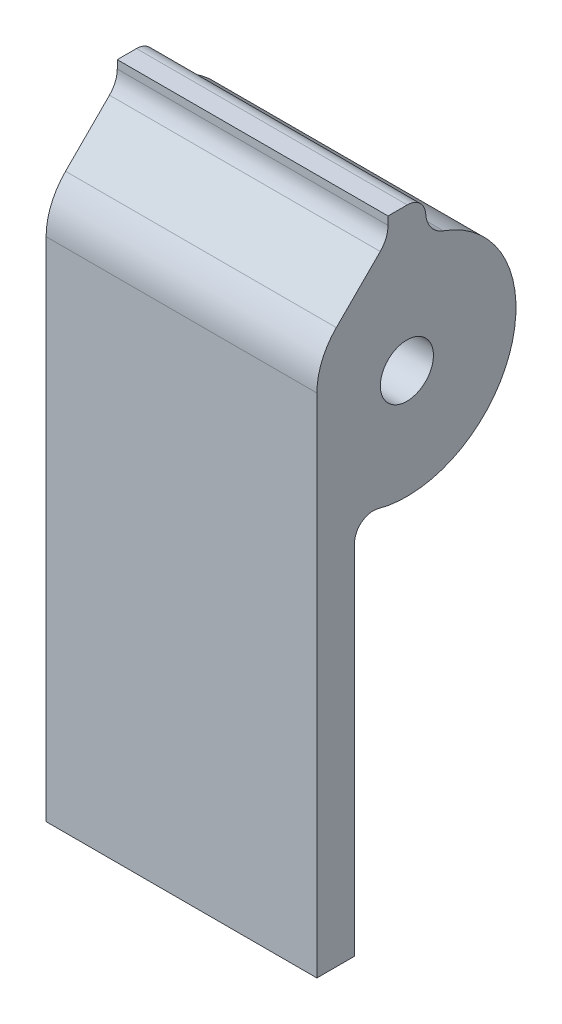
ISO-10303-21;
HEADER;
FILE_DESCRIPTION(('STEP AP214'),'2;1');
FILE_NAME('part.step','',(''),(''),'','','');
FILE_SCHEMA(('AUTOMOTIVE_DESIGN { 1 0 10303 214 1 1 1 1 }'));
ENDSEC;
DATA;
#1=APPLICATION_CONTEXT('core data for automotive mechanical design processes');
#2=APPLICATION_PROTOCOL_DEFINITION('international standard','automotive_design',2000,#1);
#3=PRODUCT_CONTEXT('',#1,'mechanical');
#4=PRODUCT('Part','Part','',(#3));
#5=PRODUCT_RELATED_PRODUCT_CATEGORY('part','',(#4));
#6=PRODUCT_DEFINITION_FORMATION('','',#4);
#7=PRODUCT_DEFINITION_CONTEXT('part definition',#1,'design');
#8=PRODUCT_DEFINITION('design','',#6,#7);
#9=PRODUCT_DEFINITION_SHAPE('','',#8);
#10=(LENGTH_UNIT() NAMED_UNIT(*) SI_UNIT(.MILLI.,.METRE.));
#11=(NAMED_UNIT(*) PLANE_ANGLE_UNIT() SI_UNIT($,.RADIAN.));
#12=(NAMED_UNIT(*) SI_UNIT($,.STERADIAN.) SOLID_ANGLE_UNIT());
#13=UNCERTAINTY_MEASURE_WITH_UNIT(LENGTH_MEASURE(1.E-05),#10,'distance_accuracy_value','');
#14=(GEOMETRIC_REPRESENTATION_CONTEXT(3) GLOBAL_UNCERTAINTY_ASSIGNED_CONTEXT((#13)) GLOBAL_UNIT_ASSIGNED_CONTEXT((#10,
#11,#12)) REPRESENTATION_CONTEXT('',''));
#15=CARTESIAN_POINT('',(0.,0.,0.));
#16=DIRECTION('',(0.,0.,1.));
#17=DIRECTION('',(1.,0.,0.));
#18=AXIS2_PLACEMENT_3D('',#15,#16,#17);
#19=CARTESIAN_POINT('',(12.954,29.8704,21.844));
#20=DIRECTION('',(-1.,0.,0.));
#21=DIRECTION('',(0.,0.,1.));
#22=AXIS2_PLACEMENT_3D('',#19,#20,#21);
#23=PLANE('',#22);
#24=CARTESIAN_POINT('',(12.954,16.1544,13.2334));
#25=DIRECTION('',(1.,0.,0.));
#26=DIRECTION('',(0.,0.,-1.));
#27=AXIS2_PLACEMENT_3D('',#24,#25,#26);
#28=CIRCLE('',#27,2.54);
#29=CARTESIAN_POINT('',(12.954,16.1544,10.6934));
#30=VERTEX_POINT('',#29);
#31=EDGE_CURVE('E230',#30,#30,#28,.T.);
#32=ORIENTED_EDGE('',*,*,#31,.F.);
#33=EDGE_LOOP('',(#32));
#34=FACE_BOUND('',#33,.T.);
#35=DIRECTION('',(0.,0.707106781186551,-0.707106781186544));
#36=VECTOR('',#35,1.);
#37=CARTESIAN_POINT('',(12.954,28.0416,15.0368));
#38=LINE('',#37,#36);
#39=CARTESIAN_POINT('',(12.954,23.0942719394653,19.9841280605346));
#40=VERTEX_POINT('',#39);
#41=CARTESIAN_POINT('',(12.954,27.2976512242138,15.7807487757862));
#42=VERTEX_POINT('',#41);
#43=EDGE_CURVE('E134',#40,#42,#38,.T.);
#44=ORIENTED_EDGE('',*,*,#43,.F.);
#45=CARTESIAN_POINT('',(12.954,18.6041438789308,15.494));
#46=DIRECTION('',(-1.,0.,0.));
#47=DIRECTION('',(0.,0.,1.));
#48=AXIS2_PLACEMENT_3D('',#45,#46,#47);
#49=CIRCLE('',#48,6.35);
#50=CARTESIAN_POINT('',(12.954,18.6041438789308,21.844));
#51=VERTEX_POINT('',#50);
#52=EDGE_CURVE('E56',#40,#51,#49,.F.);
#53=ORIENTED_EDGE('',*,*,#52,.T.);
#54=DIRECTION('',(0.,1.,0.));
#55=VECTOR('',#54,1.);
#56=CARTESIAN_POINT('',(12.954,29.8704,21.844));
#57=LINE('',#56,#55);
#58=CARTESIAN_POINT('',(12.954,-29.8704,21.844));
#59=VERTEX_POINT('',#58);
#60=EDGE_CURVE('E217',#59,#51,#57,.T.);
#61=ORIENTED_EDGE('',*,*,#60,.F.);
#62=DIRECTION('',(0.,0.,-1.));
#63=VECTOR('',#62,1.);
#64=CARTESIAN_POINT('',(12.954,-29.8704,21.844));
#65=LINE('',#64,#63);
#66=CARTESIAN_POINT('',(12.954,-29.8704,18.2372));
#67=VERTEX_POINT('',#66);
#68=EDGE_CURVE('E151',#59,#67,#65,.T.);
#69=ORIENTED_EDGE('',*,*,#68,.T.);
#70=DIRECTION('',(0.,-1.,0.));
#71=VECTOR('',#70,1.);
#72=CARTESIAN_POINT('',(12.954,6.99235558185838,18.2372));
#73=LINE('',#72,#71);
#74=CARTESIAN_POINT('',(12.954,4.37055185433892,18.2372));
#75=VERTEX_POINT('',#74);
#76=EDGE_CURVE('E141',#75,#67,#73,.T.);
#77=ORIENTED_EDGE('',*,*,#76,.F.);
#78=CARTESIAN_POINT('',(12.954,4.37055185433892,16.4592));
#79=DIRECTION('',(-1.,0.,0.));
#80=DIRECTION('',(0.,0.,1.));
#81=AXIS2_PLACEMENT_3D('',#78,#79,#80);
#82=CIRCLE('',#81,1.778);
#83=CARTESIAN_POINT('',(12.954,6.08545698988211,15.9897488565489));
#84=VERTEX_POINT('',#83);
#85=EDGE_CURVE('E191',#75,#84,#82,.T.);
#86=ORIENTED_EDGE('',*,*,#85,.T.);
#87=CARTESIAN_POINT('',(12.954,16.1544,13.2334));
#88=DIRECTION('',(-1.,0.,0.));
#89=DIRECTION('',(0.,0.,-1.));
#90=AXIS2_PLACEMENT_3D('',#87,#88,#89);
#91=CIRCLE('',#90,10.4394);
#92=CARTESIAN_POINT('',(12.954,25.9919348574545,9.73998043052837));
#93=VERTEX_POINT('',#92);
#94=EDGE_CURVE('E223',#93,#84,#91,.T.);
#95=ORIENTED_EDGE('',*,*,#94,.F.);
#96=CARTESIAN_POINT('',(12.954,28.3854956500225,8.89));
#97=DIRECTION('',(-1.,0.,0.));
#98=DIRECTION('',(0.,0.,1.));
#99=AXIS2_PLACEMENT_3D('',#96,#97,#98);
#100=CIRCLE('',#99,2.54);
#101=CARTESIAN_POINT('',(12.954,28.2130864441269,11.4241418795566));
#102=VERTEX_POINT('',#101);
#103=EDGE_CURVE('E173',#93,#102,#100,.T.);
#104=ORIENTED_EDGE('',*,*,#103,.T.);
#105=CARTESIAN_POINT('',(12.954,28.0924,13.1980411952461));
#106=DIRECTION('',(-1.,0.,0.));
#107=DIRECTION('',(0.,0.,1.));
#108=AXIS2_PLACEMENT_3D('',#105,#106,#107);
#109=CIRCLE('',#108,1.778);
#110=CARTESIAN_POINT('',(12.954,29.8704,13.1980411952461));
#111=VERTEX_POINT('',#110);
#112=EDGE_CURVE('E189',#102,#111,#109,.F.);
#113=ORIENTED_EDGE('',*,*,#112,.T.);
#114=DIRECTION('',(0.,0.,-1.));
#115=VECTOR('',#114,1.);
#116=CARTESIAN_POINT('',(12.954,29.8704,21.844));
#117=LINE('',#116,#115);
#118=CARTESIAN_POINT('',(12.954,29.8704,15.0368));
#119=VERTEX_POINT('',#118);
#120=EDGE_CURVE('E146',#119,#111,#117,.T.);
#121=ORIENTED_EDGE('',*,*,#120,.F.);
#122=DIRECTION('',(0.,1.,0.));
#123=VECTOR('',#122,1.);
#124=CARTESIAN_POINT('',(12.954,28.0416,15.0368));
#125=LINE('',#124,#123);
#126=CARTESIAN_POINT('',(12.954,29.0937024484276,15.0368));
#127=VERTEX_POINT('',#126);
#128=EDGE_CURVE('E206',#127,#119,#125,.T.);
#129=ORIENTED_EDGE('',*,*,#128,.F.);
#130=CARTESIAN_POINT('',(12.954,29.0937024484276,17.5768));
#131=DIRECTION('',(-1.,0.,0.));
#132=DIRECTION('',(0.,0.,1.));
#133=AXIS2_PLACEMENT_3D('',#130,#131,#132);
#134=CIRCLE('',#133,2.54);
#135=EDGE_CURVE('E168',#127,#42,#134,.T.);
#136=ORIENTED_EDGE('',*,*,#135,.T.);
#137=EDGE_LOOP('',(#44,#53,#61,#69,#77,#86,#95,#104,#113,#121,#129,#136));
#138=FACE_BOUND('',#137,.T.);
#139=ADVANCED_FACE('F34',(#34,#138),#23,.F.);
#140=CARTESIAN_POINT('',(-12.954,29.8704,21.844));
#141=DIRECTION('',(0.,-1.,0.));
#142=DIRECTION('',(0.,0.,-1.));
#143=AXIS2_PLACEMENT_3D('',#140,#141,#142);
#144=PLANE('',#143);
#145=ORIENTED_EDGE('',*,*,#120,.T.);
#146=DIRECTION('',(1.,0.,0.));
#147=VECTOR('',#146,1.);
#148=CARTESIAN_POINT('',(-12.954,29.8704,13.1980411952461));
#149=LINE('',#148,#147);
#150=CARTESIAN_POINT('',(-12.954,29.8704,13.1980411952461));
#151=VERTEX_POINT('',#150);
#152=EDGE_CURVE('E182',#111,#151,#149,.F.);
#153=ORIENTED_EDGE('',*,*,#152,.T.);
#154=DIRECTION('',(0.,0.,-1.));
#155=VECTOR('',#154,1.);
#156=CARTESIAN_POINT('',(-12.954,29.8704,21.844));
#157=LINE('',#156,#155);
#158=CARTESIAN_POINT('',(-12.954,29.8704,15.0368));
#159=VERTEX_POINT('',#158);
#160=EDGE_CURVE('E150',#159,#151,#157,.T.);
#161=ORIENTED_EDGE('',*,*,#160,.F.);
#162=DIRECTION('',(1.,0.,0.));
#163=VECTOR('',#162,1.);
#164=CARTESIAN_POINT('',(-12.954,29.8704,15.0368));
#165=LINE('',#164,#163);
#166=EDGE_CURVE('E214',#159,#119,#165,.T.);
#167=ORIENTED_EDGE('',*,*,#166,.T.);
#168=EDGE_LOOP('',(#145,#153,#161,#167));
#169=FACE_BOUND('',#168,.T.);
#170=ADVANCED_FACE('F237',(#169),#144,.F.);
#171=CARTESIAN_POINT('',(-12.954,29.8704,21.844));
#172=DIRECTION('',(1.,0.,0.));
#173=DIRECTION('',(0.,0.,-1.));
#174=AXIS2_PLACEMENT_3D('',#171,#172,#173);
#175=PLANE('',#174);
#176=CARTESIAN_POINT('',(-12.954,16.1544,13.2334));
#177=DIRECTION('',(1.,0.,0.));
#178=DIRECTION('',(0.,0.,-1.));
#179=AXIS2_PLACEMENT_3D('',#176,#177,#178);
#180=CIRCLE('',#179,2.54);
#181=CARTESIAN_POINT('',(-12.954,16.1544,10.6934));
#182=VERTEX_POINT('',#181);
#183=EDGE_CURVE('E225',#182,#182,#180,.T.);
#184=ORIENTED_EDGE('',*,*,#183,.T.);
#185=EDGE_LOOP('',(#184));
#186=FACE_BOUND('',#185,.T.);
#187=DIRECTION('',(0.,-1.,0.));
#188=VECTOR('',#187,1.);
#189=CARTESIAN_POINT('',(-12.954,29.8704,21.844));
#190=LINE('',#189,#188);
#191=CARTESIAN_POINT('',(-12.954,18.6041438789308,21.844));
#192=VERTEX_POINT('',#191);
#193=CARTESIAN_POINT('',(-12.954,-29.8704,21.844));
#194=VERTEX_POINT('',#193);
#195=EDGE_CURVE('E219',#192,#194,#190,.T.);
#196=ORIENTED_EDGE('',*,*,#195,.F.);
#197=CARTESIAN_POINT('',(-12.954,18.6041438789308,15.494));
#198=DIRECTION('',(1.,0.,0.));
#199=DIRECTION('',(0.,0.,-1.));
#200=AXIS2_PLACEMENT_3D('',#197,#198,#199);
#201=CIRCLE('',#200,6.35);
#202=CARTESIAN_POINT('',(-12.954,23.0942719394653,19.9841280605346));
#203=VERTEX_POINT('',#202);
#204=EDGE_CURVE('E11',#192,#203,#201,.F.);
#205=ORIENTED_EDGE('',*,*,#204,.T.);
#206=DIRECTION('',(0.,0.707106781186551,-0.707106781186544));
#207=VECTOR('',#206,1.);
#208=CARTESIAN_POINT('',(-12.954,28.0416,15.0368));
#209=LINE('',#208,#207);
#210=CARTESIAN_POINT('',(-12.954,27.2976512242138,15.7807487757862));
#211=VERTEX_POINT('',#210);
#212=EDGE_CURVE('E201',#203,#211,#209,.T.);
#213=ORIENTED_EDGE('',*,*,#212,.T.);
#214=CARTESIAN_POINT('',(-12.954,29.0937024484276,17.5768));
#215=DIRECTION('',(1.,0.,0.));
#216=DIRECTION('',(0.,0.,-1.));
#217=AXIS2_PLACEMENT_3D('',#214,#215,#216);
#218=CIRCLE('',#217,2.54);
#219=CARTESIAN_POINT('',(-12.954,29.0937024484276,15.0368));
#220=VERTEX_POINT('',#219);
#221=EDGE_CURVE('E171',#211,#220,#218,.T.);
#222=ORIENTED_EDGE('',*,*,#221,.T.);
#223=DIRECTION('',(0.,1.,0.));
#224=VECTOR('',#223,1.);
#225=CARTESIAN_POINT('',(-12.954,28.0416,15.0368));
#226=LINE('',#225,#224);
#227=EDGE_CURVE('E212',#220,#159,#226,.T.);
#228=ORIENTED_EDGE('',*,*,#227,.T.);
#229=ORIENTED_EDGE('',*,*,#160,.T.);
#230=CARTESIAN_POINT('',(-12.954,28.0924,13.1980411952461));
#231=DIRECTION('',(1.,0.,0.));
#232=DIRECTION('',(0.,0.,-1.));
#233=AXIS2_PLACEMENT_3D('',#230,#231,#232);
#234=CIRCLE('',#233,1.778);
#235=CARTESIAN_POINT('',(-12.954,28.2130864441269,11.4241418795566));
#236=VERTEX_POINT('',#235);
#237=EDGE_CURVE('E185',#151,#236,#234,.F.);
#238=ORIENTED_EDGE('',*,*,#237,.T.);
#239=CARTESIAN_POINT('',(-12.954,28.3854956500225,8.89));
#240=DIRECTION('',(1.,0.,0.));
#241=DIRECTION('',(0.,0.,-1.));
#242=AXIS2_PLACEMENT_3D('',#239,#240,#241);
#243=CIRCLE('',#242,2.54);
#244=CARTESIAN_POINT('',(-12.954,25.9919348574545,9.73998043052837));
#245=VERTEX_POINT('',#244);
#246=EDGE_CURVE('E176',#236,#245,#243,.T.);
#247=ORIENTED_EDGE('',*,*,#246,.T.);
#248=CARTESIAN_POINT('',(-12.954,16.1544,13.2334));
#249=DIRECTION('',(-1.,0.,0.));
#250=DIRECTION('',(0.,0.,-1.));
#251=AXIS2_PLACEMENT_3D('',#248,#249,#250);
#252=CIRCLE('',#251,10.4394);
#253=CARTESIAN_POINT('',(-12.954,6.08545698988211,15.9897488565489));
#254=VERTEX_POINT('',#253);
#255=EDGE_CURVE('E135',#245,#254,#252,.T.);
#256=ORIENTED_EDGE('',*,*,#255,.T.);
#257=CARTESIAN_POINT('',(-12.954,4.37055185433892,16.4592));
#258=DIRECTION('',(1.,0.,0.));
#259=DIRECTION('',(0.,0.,-1.));
#260=AXIS2_PLACEMENT_3D('',#257,#258,#259);
#261=CIRCLE('',#260,1.778);
#262=CARTESIAN_POINT('',(-12.954,4.37055185433892,18.2372));
#263=VERTEX_POINT('',#262);
#264=EDGE_CURVE('E130',#254,#263,#261,.T.);
#265=ORIENTED_EDGE('',*,*,#264,.T.);
#266=DIRECTION('',(0.,-1.,0.));
#267=VECTOR('',#266,1.);
#268=CARTESIAN_POINT('',(-12.954,6.99235558185838,18.2372));
#269=LINE('',#268,#267);
#270=CARTESIAN_POINT('',(-12.954,-29.8704,18.2372));
#271=VERTEX_POINT('',#270);
#272=EDGE_CURVE('E122',#263,#271,#269,.T.);
#273=ORIENTED_EDGE('',*,*,#272,.T.);
#274=DIRECTION('',(0.,0.,-1.));
#275=VECTOR('',#274,1.);
#276=CARTESIAN_POINT('',(-12.954,-29.8704,21.844));
#277=LINE('',#276,#275);
#278=EDGE_CURVE('E126',#194,#271,#277,.T.);
#279=ORIENTED_EDGE('',*,*,#278,.F.);
#280=EDGE_LOOP('',(#196,#205,#213,#222,#228,#229,#238,#247,#256,#265,#273,#279));
#281=FACE_BOUND('',#280,.T.);
#282=ADVANCED_FACE('F124',(#186,#281),#175,.F.);
#283=CARTESIAN_POINT('',(-12.954,-29.8704,21.844));
#284=DIRECTION('',(0.,1.,0.));
#285=DIRECTION('',(0.,0.,1.));
#286=AXIS2_PLACEMENT_3D('',#283,#284,#285);
#287=PLANE('',#286);
#288=ORIENTED_EDGE('',*,*,#278,.T.);
#289=DIRECTION('',(1.,0.,0.));
#290=VECTOR('',#289,1.);
#291=CARTESIAN_POINT('',(-12.954,-29.8704,18.2372));
#292=LINE('',#291,#290);
#293=EDGE_CURVE('E138',#271,#67,#292,.T.);
#294=ORIENTED_EDGE('',*,*,#293,.T.);
#295=ORIENTED_EDGE('',*,*,#68,.F.);
#296=DIRECTION('',(1.,0.,0.));
#297=VECTOR('',#296,1.);
#298=CARTESIAN_POINT('',(-12.954,-29.8704,21.844));
#299=LINE('',#298,#297);
#300=EDGE_CURVE('E149',#194,#59,#299,.T.);
#301=ORIENTED_EDGE('',*,*,#300,.F.);
#302=EDGE_LOOP('',(#288,#294,#295,#301));
#303=FACE_BOUND('',#302,.T.);
#304=ADVANCED_FACE('F148',(#303),#287,.F.);
#305=CARTESIAN_POINT('',(0.,0.,21.844));
#306=DIRECTION('',(0.,0.,1.));
#307=DIRECTION('',(1.,0.,0.));
#308=AXIS2_PLACEMENT_3D('',#305,#306,#307);
#309=PLANE('',#308);
#310=ORIENTED_EDGE('',*,*,#60,.T.);
#311=DIRECTION('',(1.,0.,0.));
#312=VECTOR('',#311,1.);
#313=CARTESIAN_POINT('',(-12.954,18.6041438789308,21.844));
#314=LINE('',#313,#312);
#315=EDGE_CURVE('E42',#51,#192,#314,.F.);
#316=ORIENTED_EDGE('',*,*,#315,.T.);
#317=ORIENTED_EDGE('',*,*,#195,.T.);
#318=ORIENTED_EDGE('',*,*,#300,.T.);
#319=EDGE_LOOP('',(#310,#316,#317,#318));
#320=FACE_BOUND('',#319,.T.);
#321=ADVANCED_FACE('F220',(#320),#309,.T.);
#322=CARTESIAN_POINT('',(-12.954,28.0416,15.0368));
#323=DIRECTION('',(0.,0.,-1.));
#324=DIRECTION('',(-1.,0.,0.));
#325=AXIS2_PLACEMENT_3D('',#322,#323,#324);
#326=PLANE('',#325);
#327=ORIENTED_EDGE('',*,*,#227,.F.);
#328=DIRECTION('',(1.,0.,0.));
#329=VECTOR('',#328,1.);
#330=CARTESIAN_POINT('',(12.954,29.0937024484276,15.0368));
#331=LINE('',#330,#329);
#332=EDGE_CURVE('E145',#220,#127,#331,.T.);
#333=ORIENTED_EDGE('',*,*,#332,.T.);
#334=ORIENTED_EDGE('',*,*,#128,.T.);
#335=ORIENTED_EDGE('',*,*,#166,.F.);
#336=EDGE_LOOP('',(#327,#333,#334,#335));
#337=FACE_BOUND('',#336,.T.);
#338=ADVANCED_FACE('F271',(#337),#326,.F.);
#339=CARTESIAN_POINT('',(-12.954,28.0416,15.0368));
#340=DIRECTION('',(0.,-0.707106781186544,-0.707106781186551));
#341=DIRECTION('',(0.,0.707106781186551,-0.707106781186544));
#342=AXIS2_PLACEMENT_3D('',#339,#340,#341);
#343=PLANE('',#342);
#344=ORIENTED_EDGE('',*,*,#212,.F.);
#345=DIRECTION('',(1.,0.,0.));
#346=VECTOR('',#345,1.);
#347=CARTESIAN_POINT('',(12.954,23.0942719394653,19.9841280605346));
#348=LINE('',#347,#346);
#349=EDGE_CURVE('E194',#203,#40,#348,.T.);
#350=ORIENTED_EDGE('',*,*,#349,.T.);
#351=ORIENTED_EDGE('',*,*,#43,.T.);
#352=DIRECTION('',(1.,0.,0.));
#353=VECTOR('',#352,1.);
#354=CARTESIAN_POINT('',(-12.954,27.2976512242138,15.7807487757862));
#355=LINE('',#354,#353);
#356=EDGE_CURVE('E162',#42,#211,#355,.F.);
#357=ORIENTED_EDGE('',*,*,#356,.T.);
#358=EDGE_LOOP('',(#344,#350,#351,#357));
#359=FACE_BOUND('',#358,.T.);
#360=ADVANCED_FACE('F200',(#359),#343,.F.);
#361=CARTESIAN_POINT('',(-12.954,6.99235558185838,18.2372));
#362=DIRECTION('',(0.,0.,1.));
#363=DIRECTION('',(0.,-1.,0.));
#364=AXIS2_PLACEMENT_3D('',#361,#362,#363);
#365=PLANE('',#364);
#366=ORIENTED_EDGE('',*,*,#272,.F.);
#367=DIRECTION('',(-1.,0.,0.));
#368=VECTOR('',#367,1.);
#369=CARTESIAN_POINT('',(12.954,4.37055185433892,18.2372));
#370=LINE('',#369,#368);
#371=EDGE_CURVE('E178',#263,#75,#370,.F.);
#372=ORIENTED_EDGE('',*,*,#371,.T.);
#373=ORIENTED_EDGE('',*,*,#76,.T.);
#374=ORIENTED_EDGE('',*,*,#293,.F.);
#375=EDGE_LOOP('',(#366,#372,#373,#374));
#376=FACE_BOUND('',#375,.T.);
#377=ADVANCED_FACE('F139',(#376),#365,.F.);
#378=CARTESIAN_POINT('',(-12.954,16.1544,13.2334));
#379=DIRECTION('',(1.,0.,0.));
#380=DIRECTION('',(0.,0.,-1.));
#381=AXIS2_PLACEMENT_3D('',#378,#379,#380);
#382=CYLINDRICAL_SURFACE('',#381,10.4394);
#383=ORIENTED_EDGE('',*,*,#94,.T.);
#384=DIRECTION('',(1.,0.,0.));
#385=VECTOR('',#384,1.);
#386=CARTESIAN_POINT('',(-12.954,6.08545698988211,15.9897488565489));
#387=LINE('',#386,#385);
#388=EDGE_CURVE('E180',#84,#254,#387,.F.);
#389=ORIENTED_EDGE('',*,*,#388,.T.);
#390=ORIENTED_EDGE('',*,*,#255,.F.);
#391=DIRECTION('',(1.,0.,0.));
#392=VECTOR('',#391,1.);
#393=CARTESIAN_POINT('',(-12.954,25.9919348574545,9.73998043052837));
#394=LINE('',#393,#392);
#395=EDGE_CURVE('E165',#245,#93,#394,.T.);
#396=ORIENTED_EDGE('',*,*,#395,.T.);
#397=EDGE_LOOP('',(#383,#389,#390,#396));
#398=FACE_BOUND('',#397,.T.);
#399=ADVANCED_FACE('F278',(#398),#382,.T.);
#400=CARTESIAN_POINT('',(-12.954,16.1544,13.2334));
#401=DIRECTION('',(1.,0.,0.));
#402=DIRECTION('',(0.,0.,-1.));
#403=AXIS2_PLACEMENT_3D('',#400,#401,#402);
#404=CYLINDRICAL_SURFACE('',#403,2.54);
#405=ORIENTED_EDGE('',*,*,#183,.F.);
#406=EDGE_LOOP('',(#405));
#407=FACE_BOUND('',#406,.T.);
#408=ORIENTED_EDGE('',*,*,#31,.T.);
#409=EDGE_LOOP('',(#408));
#410=FACE_BOUND('',#409,.T.);
#411=ADVANCED_FACE('F234',(#407,#410),#404,.F.);
#412=CARTESIAN_POINT('',(-12.954,29.0937024484276,17.5768));
#413=DIRECTION('',(-1.,0.,0.));
#414=DIRECTION('',(0.,0.,1.));
#415=AXIS2_PLACEMENT_3D('',#412,#413,#414);
#416=CYLINDRICAL_SURFACE('',#415,2.54);
#417=ORIENTED_EDGE('',*,*,#221,.F.);
#418=ORIENTED_EDGE('',*,*,#356,.F.);
#419=ORIENTED_EDGE('',*,*,#135,.F.);
#420=ORIENTED_EDGE('',*,*,#332,.F.);
#421=EDGE_LOOP('',(#417,#418,#419,#420));
#422=FACE_BOUND('',#421,.T.);
#423=ADVANCED_FACE('F246',(#422),#416,.F.);
#424=CARTESIAN_POINT('',(-12.954,28.3854956500225,8.89));
#425=DIRECTION('',(1.,0.,0.));
#426=DIRECTION('',(0.,0.,-1.));
#427=AXIS2_PLACEMENT_3D('',#424,#425,#426);
#428=CYLINDRICAL_SURFACE('',#427,2.54);
#429=ORIENTED_EDGE('',*,*,#246,.F.);
#430=DIRECTION('',(1.,0.,0.));
#431=VECTOR('',#430,1.);
#432=CARTESIAN_POINT('',(-12.954,28.2130864441269,11.4241418795566));
#433=LINE('',#432,#431);
#434=EDGE_CURVE('E187',#236,#102,#433,.T.);
#435=ORIENTED_EDGE('',*,*,#434,.T.);
#436=ORIENTED_EDGE('',*,*,#103,.F.);
#437=ORIENTED_EDGE('',*,*,#395,.F.);
#438=EDGE_LOOP('',(#429,#435,#436,#437));
#439=FACE_BOUND('',#438,.T.);
#440=ADVANCED_FACE('F249',(#439),#428,.F.);
#441=CARTESIAN_POINT('',(-12.954,4.37055185433892,16.4592));
#442=DIRECTION('',(1.,0.,0.));
#443=DIRECTION('',(0.,0.,-1.));
#444=AXIS2_PLACEMENT_3D('',#441,#442,#443);
#445=CYLINDRICAL_SURFACE('',#444,1.778);
#446=ORIENTED_EDGE('',*,*,#264,.F.);
#447=ORIENTED_EDGE('',*,*,#388,.F.);
#448=ORIENTED_EDGE('',*,*,#85,.F.);
#449=ORIENTED_EDGE('',*,*,#371,.F.);
#450=EDGE_LOOP('',(#446,#447,#448,#449));
#451=FACE_BOUND('',#450,.T.);
#452=ADVANCED_FACE('F253',(#451),#445,.F.);
#453=CARTESIAN_POINT('',(-12.954,28.0924,13.1980411952461));
#454=DIRECTION('',(1.,0.,0.));
#455=DIRECTION('',(0.,0.,-1.));
#456=AXIS2_PLACEMENT_3D('',#453,#454,#455);
#457=CYLINDRICAL_SURFACE('',#456,1.778);
#458=ORIENTED_EDGE('',*,*,#112,.F.);
#459=ORIENTED_EDGE('',*,*,#434,.F.);
#460=ORIENTED_EDGE('',*,*,#237,.F.);
#461=ORIENTED_EDGE('',*,*,#152,.F.);
#462=EDGE_LOOP('',(#458,#459,#460,#461));
#463=FACE_BOUND('',#462,.T.);
#464=ADVANCED_FACE('F256',(#463),#457,.T.);
#465=CARTESIAN_POINT('',(-12.954,18.6041438789308,15.494));
#466=DIRECTION('',(-1.,0.,0.));
#467=DIRECTION('',(0.,0.,1.));
#468=AXIS2_PLACEMENT_3D('',#465,#466,#467);
#469=CYLINDRICAL_SURFACE('',#468,6.35);
#470=ORIENTED_EDGE('',*,*,#204,.F.);
#471=ORIENTED_EDGE('',*,*,#315,.F.);
#472=ORIENTED_EDGE('',*,*,#52,.F.);
#473=ORIENTED_EDGE('',*,*,#349,.F.);
#474=EDGE_LOOP('',(#470,#471,#472,#473));
#475=FACE_BOUND('',#474,.T.);
#476=ADVANCED_FACE('F36',(#475),#469,.T.);
#477=CLOSED_SHELL('',(#139,#170,#282,#304,#321,#338,#360,#377,#399,#411,#423,#440,#452,#464,#476));
#478=MANIFOLD_SOLID_BREP('B2',#477);
#479=ADVANCED_BREP_SHAPE_REPRESENTATION('',(#18,#478),#14);
#480=SHAPE_DEFINITION_REPRESENTATION(#9,#479);
ENDSEC;
END-ISO-10303-21;
